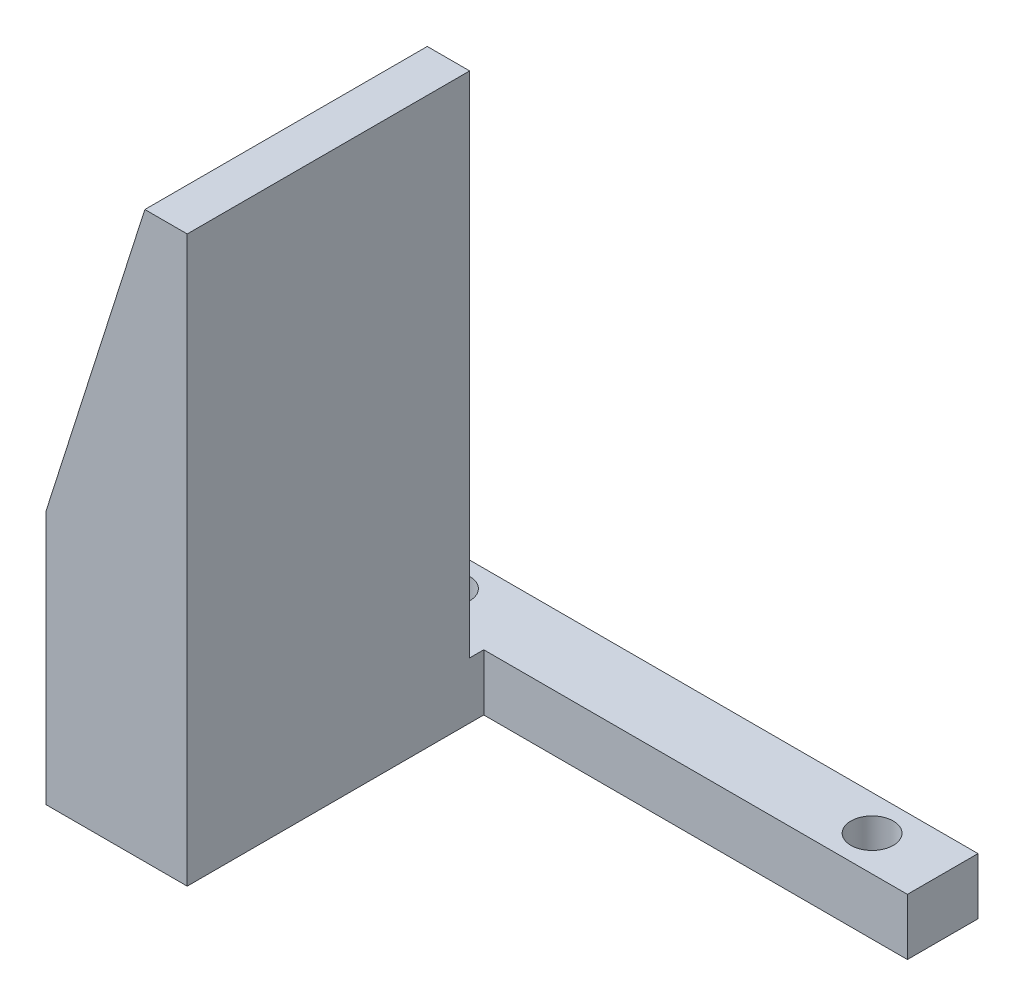
ISO-10303-21;
HEADER;
FILE_DESCRIPTION(('STEP AP214'),'2;1');
FILE_NAME('part.step','',(''),(''),'','','');
FILE_SCHEMA(('AUTOMOTIVE_DESIGN { 1 0 10303 214 1 1 1 1 }'));
ENDSEC;
DATA;
#1=APPLICATION_CONTEXT('core data for automotive mechanical design processes');
#2=APPLICATION_PROTOCOL_DEFINITION('international standard','automotive_design',2000,#1);
#3=PRODUCT_CONTEXT('',#1,'mechanical');
#4=PRODUCT('Part','Part','',(#3));
#5=PRODUCT_RELATED_PRODUCT_CATEGORY('part','',(#4));
#6=PRODUCT_DEFINITION_FORMATION('','',#4);
#7=PRODUCT_DEFINITION_CONTEXT('part definition',#1,'design');
#8=PRODUCT_DEFINITION('design','',#6,#7);
#9=PRODUCT_DEFINITION_SHAPE('','',#8);
#10=(LENGTH_UNIT() NAMED_UNIT(*) SI_UNIT(.MILLI.,.METRE.));
#11=(NAMED_UNIT(*) PLANE_ANGLE_UNIT() SI_UNIT($,.RADIAN.));
#12=(NAMED_UNIT(*) SI_UNIT($,.STERADIAN.) SOLID_ANGLE_UNIT());
#13=UNCERTAINTY_MEASURE_WITH_UNIT(LENGTH_MEASURE(1.E-05),#10,'distance_accuracy_value','');
#14=(GEOMETRIC_REPRESENTATION_CONTEXT(3) GLOBAL_UNCERTAINTY_ASSIGNED_CONTEXT((#13)) GLOBAL_UNIT_ASSIGNED_CONTEXT((#10,
#11,#12)) REPRESENTATION_CONTEXT('',''));
#15=CARTESIAN_POINT('',(0.,0.,0.));
#16=DIRECTION('',(0.,0.,1.));
#17=DIRECTION('',(1.,0.,0.));
#18=AXIS2_PLACEMENT_3D('',#15,#16,#17);
#19=CARTESIAN_POINT('',(-10.,0.,20.));
#20=DIRECTION('',(0.,1.,0.));
#21=DIRECTION('',(0.,0.,1.));
#22=AXIS2_PLACEMENT_3D('',#19,#20,#21);
#23=PLANE('',#22);
#24=DIRECTION('',(0.,0.,-1.));
#25=VECTOR('',#24,1.);
#26=CARTESIAN_POINT('',(-10.,0.,20.));
#27=LINE('',#26,#25);
#28=CARTESIAN_POINT('',(-10.,0.,20.));
#29=VERTEX_POINT('',#28);
#30=CARTESIAN_POINT('',(-10.,0.,-6.));
#31=VERTEX_POINT('',#30);
#32=EDGE_CURVE('E117',#29,#31,#27,.T.);
#33=ORIENTED_EDGE('',*,*,#32,.T.);
#34=DIRECTION('',(1.,0.,0.));
#35=VECTOR('',#34,1.);
#36=CARTESIAN_POINT('',(-10.,0.,-6.));
#37=LINE('',#36,#35);
#38=CARTESIAN_POINT('',(30.,0.,-6.));
#39=VERTEX_POINT('',#38);
#40=EDGE_CURVE('E183',#31,#39,#37,.T.);
#41=ORIENTED_EDGE('',*,*,#40,.T.);
#42=DIRECTION('',(0.,0.,1.));
#43=VECTOR('',#42,1.);
#44=CARTESIAN_POINT('',(30.,0.,-6.));
#45=LINE('',#44,#43);
#46=CARTESIAN_POINT('',(30.,0.,-1.));
#47=VERTEX_POINT('',#46);
#48=EDGE_CURVE('E179',#39,#47,#45,.T.);
#49=ORIENTED_EDGE('',*,*,#48,.T.);
#50=DIRECTION('',(-1.,0.,0.));
#51=VECTOR('',#50,1.);
#52=CARTESIAN_POINT('',(30.,0.,-1.));
#53=LINE('',#52,#51);
#54=CARTESIAN_POINT('',(0.,0.,-1.));
#55=VERTEX_POINT('',#54);
#56=EDGE_CURVE('E176',#47,#55,#53,.T.);
#57=ORIENTED_EDGE('',*,*,#56,.T.);
#58=DIRECTION('',(0.,0.,-1.));
#59=VECTOR('',#58,1.);
#60=CARTESIAN_POINT('',(0.,0.,20.));
#61=LINE('',#60,#59);
#62=CARTESIAN_POINT('',(0.,0.,20.));
#63=VERTEX_POINT('',#62);
#64=EDGE_CURVE('E11',#63,#55,#61,.T.);
#65=ORIENTED_EDGE('',*,*,#64,.F.);
#66=DIRECTION('',(1.,0.,0.));
#67=VECTOR('',#66,1.);
#68=CARTESIAN_POINT('',(-10.,0.,20.));
#69=LINE('',#68,#67);
#70=EDGE_CURVE('E133',#29,#63,#69,.T.);
#71=ORIENTED_EDGE('',*,*,#70,.F.);
#72=EDGE_LOOP('',(#33,#41,#49,#57,#65,#71));
#73=FACE_BOUND('',#72,.T.);
#74=CARTESIAN_POINT('',(-5.,0.,-3.5));
#75=DIRECTION('',(0.,-1.,0.));
#76=DIRECTION('',(0.,0.,-1.));
#77=AXIS2_PLACEMENT_3D('',#74,#75,#76);
#78=CIRCLE('',#77,1.5);
#79=CARTESIAN_POINT('',(-5.,0.,-5.));
#80=VERTEX_POINT('',#79);
#81=EDGE_CURVE('E214',#80,#80,#78,.T.);
#82=ORIENTED_EDGE('',*,*,#81,.F.);
#83=EDGE_LOOP('',(#82));
#84=FACE_BOUND('',#83,.T.);
#85=CARTESIAN_POINT('',(25.,0.,-3.5));
#86=DIRECTION('',(0.,-1.,0.));
#87=DIRECTION('',(0.,0.,-1.));
#88=AXIS2_PLACEMENT_3D('',#85,#86,#87);
#89=CIRCLE('',#88,1.5);
#90=CARTESIAN_POINT('',(25.,0.,-5.));
#91=VERTEX_POINT('',#90);
#92=EDGE_CURVE('E206',#91,#91,#89,.T.);
#93=ORIENTED_EDGE('',*,*,#92,.F.);
#94=EDGE_LOOP('',(#93));
#95=FACE_BOUND('',#94,.T.);
#96=ADVANCED_FACE('F39',(#73,#84,#95),#23,.F.);
#97=CARTESIAN_POINT('',(0.,0.,20.));
#98=DIRECTION('',(-1.,0.,0.));
#99=DIRECTION('',(0.,0.,1.));
#100=AXIS2_PLACEMENT_3D('',#97,#98,#99);
#101=PLANE('',#100);
#102=ORIENTED_EDGE('',*,*,#64,.T.);
#103=DIRECTION('',(0.,-1.,0.));
#104=VECTOR('',#103,1.);
#105=CARTESIAN_POINT('',(0.,4.,-1.));
#106=LINE('',#105,#104);
#107=CARTESIAN_POINT('',(0.,4.,-1.));
#108=VERTEX_POINT('',#107);
#109=EDGE_CURVE('E124',#108,#55,#106,.T.);
#110=ORIENTED_EDGE('',*,*,#109,.F.);
#111=DIRECTION('',(0.,0.,1.));
#112=VECTOR('',#111,1.);
#113=CARTESIAN_POINT('',(0.,4.,-1.));
#114=LINE('',#113,#112);
#115=CARTESIAN_POINT('',(0.,4.,0.));
#116=VERTEX_POINT('',#115);
#117=EDGE_CURVE('E165',#108,#116,#114,.T.);
#118=ORIENTED_EDGE('',*,*,#117,.T.);
#119=DIRECTION('',(0.,1.,0.));
#120=VECTOR('',#119,1.);
#121=CARTESIAN_POINT('',(0.,0.,0.));
#122=LINE('',#121,#120);
#123=CARTESIAN_POINT('',(0.,40.,0.));
#124=VERTEX_POINT('',#123);
#125=EDGE_CURVE('E121',#116,#124,#122,.T.);
#126=ORIENTED_EDGE('',*,*,#125,.T.);
#127=DIRECTION('',(0.,0.,-1.));
#128=VECTOR('',#127,1.);
#129=CARTESIAN_POINT('',(0.,40.,20.));
#130=LINE('',#129,#128);
#131=CARTESIAN_POINT('',(0.,40.,20.));
#132=VERTEX_POINT('',#131);
#133=EDGE_CURVE('E47',#132,#124,#130,.T.);
#134=ORIENTED_EDGE('',*,*,#133,.F.);
#135=DIRECTION('',(0.,1.,0.));
#136=VECTOR('',#135,1.);
#137=CARTESIAN_POINT('',(0.,0.,20.));
#138=LINE('',#137,#136);
#139=EDGE_CURVE('E90',#63,#132,#138,.T.);
#140=ORIENTED_EDGE('',*,*,#139,.F.);
#141=EDGE_LOOP('',(#102,#110,#118,#126,#134,#140));
#142=FACE_BOUND('',#141,.T.);
#143=ADVANCED_FACE('F233',(#142),#101,.F.);
#144=CARTESIAN_POINT('',(0.,40.,20.));
#145=DIRECTION('',(0.,-1.,0.));
#146=DIRECTION('',(0.,0.,-1.));
#147=AXIS2_PLACEMENT_3D('',#144,#145,#146);
#148=PLANE('',#147);
#149=DIRECTION('',(-1.,0.,0.));
#150=VECTOR('',#149,1.);
#151=CARTESIAN_POINT('',(0.,40.,0.));
#152=LINE('',#151,#150);
#153=CARTESIAN_POINT('',(-3.,40.,0.));
#154=VERTEX_POINT('',#153);
#155=EDGE_CURVE('E109',#124,#154,#152,.T.);
#156=ORIENTED_EDGE('',*,*,#155,.T.);
#157=DIRECTION('',(0.,0.,-1.));
#158=VECTOR('',#157,1.);
#159=CARTESIAN_POINT('',(-3.,40.,20.));
#160=LINE('',#159,#158);
#161=CARTESIAN_POINT('',(-3.,40.,20.));
#162=VERTEX_POINT('',#161);
#163=EDGE_CURVE('E106',#162,#154,#160,.T.);
#164=ORIENTED_EDGE('',*,*,#163,.F.);
#165=DIRECTION('',(-1.,0.,0.));
#166=VECTOR('',#165,1.);
#167=CARTESIAN_POINT('',(0.,40.,20.));
#168=LINE('',#167,#166);
#169=EDGE_CURVE('E97',#132,#162,#168,.T.);
#170=ORIENTED_EDGE('',*,*,#169,.F.);
#171=ORIENTED_EDGE('',*,*,#133,.T.);
#172=EDGE_LOOP('',(#156,#164,#170,#171));
#173=FACE_BOUND('',#172,.T.);
#174=ADVANCED_FACE('F107',(#173),#148,.F.);
#175=CARTESIAN_POINT('',(-3.,40.,20.));
#176=DIRECTION('',(0.952925780013262,-0.303203657276947,0.));
#177=DIRECTION('',(0.303203657276947,0.952925780013262,0.));
#178=AXIS2_PLACEMENT_3D('',#175,#176,#177);
#179=PLANE('',#178);
#180=DIRECTION('',(-0.303203657276947,-0.952925780013262,0.));
#181=VECTOR('',#180,1.);
#182=CARTESIAN_POINT('',(-3.,40.,0.));
#183=LINE('',#182,#181);
#184=CARTESIAN_POINT('',(-10.,18.,0.));
#185=VERTEX_POINT('',#184);
#186=EDGE_CURVE('E82',#154,#185,#183,.T.);
#187=ORIENTED_EDGE('',*,*,#186,.T.);
#188=DIRECTION('',(0.,0.,-1.));
#189=VECTOR('',#188,1.);
#190=CARTESIAN_POINT('',(-10.,18.,20.));
#191=LINE('',#190,#189);
#192=CARTESIAN_POINT('',(-10.,18.,20.));
#193=VERTEX_POINT('',#192);
#194=EDGE_CURVE('E111',#193,#185,#191,.T.);
#195=ORIENTED_EDGE('',*,*,#194,.F.);
#196=DIRECTION('',(-0.303203657276947,-0.952925780013262,0.));
#197=VECTOR('',#196,1.);
#198=CARTESIAN_POINT('',(-3.,40.,20.));
#199=LINE('',#198,#197);
#200=EDGE_CURVE('E101',#162,#193,#199,.T.);
#201=ORIENTED_EDGE('',*,*,#200,.F.);
#202=ORIENTED_EDGE('',*,*,#163,.T.);
#203=EDGE_LOOP('',(#187,#195,#201,#202));
#204=FACE_BOUND('',#203,.T.);
#205=ADVANCED_FACE('F113',(#204),#179,.F.);
#206=CARTESIAN_POINT('',(-10.,18.,20.));
#207=DIRECTION('',(1.,0.,0.));
#208=DIRECTION('',(0.,1.,0.));
#209=AXIS2_PLACEMENT_3D('',#206,#207,#208);
#210=PLANE('',#209);
#211=DIRECTION('',(0.,-1.,0.));
#212=VECTOR('',#211,1.);
#213=CARTESIAN_POINT('',(-10.,18.,0.));
#214=LINE('',#213,#212);
#215=CARTESIAN_POINT('',(-10.,4.,0.));
#216=VERTEX_POINT('',#215);
#217=EDGE_CURVE('E129',#185,#216,#214,.T.);
#218=ORIENTED_EDGE('',*,*,#217,.T.);
#219=DIRECTION('',(0.,0.,-1.));
#220=VECTOR('',#219,1.);
#221=CARTESIAN_POINT('',(-10.,4.,0.));
#222=LINE('',#221,#220);
#223=CARTESIAN_POINT('',(-10.,4.,-6.));
#224=VERTEX_POINT('',#223);
#225=EDGE_CURVE('E54',#216,#224,#222,.T.);
#226=ORIENTED_EDGE('',*,*,#225,.T.);
#227=DIRECTION('',(0.,-1.,0.));
#228=VECTOR('',#227,1.);
#229=CARTESIAN_POINT('',(-10.,4.,-6.));
#230=LINE('',#229,#228);
#231=EDGE_CURVE('E151',#224,#31,#230,.T.);
#232=ORIENTED_EDGE('',*,*,#231,.T.);
#233=ORIENTED_EDGE('',*,*,#32,.F.);
#234=DIRECTION('',(0.,-1.,0.));
#235=VECTOR('',#234,1.);
#236=CARTESIAN_POINT('',(-10.,18.,20.));
#237=LINE('',#236,#235);
#238=EDGE_CURVE('E63',#193,#29,#237,.T.);
#239=ORIENTED_EDGE('',*,*,#238,.F.);
#240=ORIENTED_EDGE('',*,*,#194,.T.);
#241=EDGE_LOOP('',(#218,#226,#232,#233,#239,#240));
#242=FACE_BOUND('',#241,.T.);
#243=ADVANCED_FACE('F145',(#242),#210,.F.);
#244=CARTESIAN_POINT('',(0.,0.,20.));
#245=DIRECTION('',(0.,0.,1.));
#246=DIRECTION('',(1.,0.,0.));
#247=AXIS2_PLACEMENT_3D('',#244,#245,#246);
#248=PLANE('',#247);
#249=ORIENTED_EDGE('',*,*,#70,.T.);
#250=ORIENTED_EDGE('',*,*,#139,.T.);
#251=ORIENTED_EDGE('',*,*,#169,.T.);
#252=ORIENTED_EDGE('',*,*,#200,.T.);
#253=ORIENTED_EDGE('',*,*,#238,.T.);
#254=EDGE_LOOP('',(#249,#250,#251,#252,#253));
#255=FACE_BOUND('',#254,.T.);
#256=ADVANCED_FACE('F99',(#255),#248,.T.);
#257=CARTESIAN_POINT('',(0.,0.,0.));
#258=DIRECTION('',(0.,0.,1.));
#259=DIRECTION('',(1.,0.,0.));
#260=AXIS2_PLACEMENT_3D('',#257,#258,#259);
#261=PLANE('',#260);
#262=ORIENTED_EDGE('',*,*,#125,.F.);
#263=DIRECTION('',(-1.,0.,0.));
#264=VECTOR('',#263,1.);
#265=CARTESIAN_POINT('',(0.,4.,0.));
#266=LINE('',#265,#264);
#267=EDGE_CURVE('E143',#116,#216,#266,.T.);
#268=ORIENTED_EDGE('',*,*,#267,.T.);
#269=ORIENTED_EDGE('',*,*,#217,.F.);
#270=ORIENTED_EDGE('',*,*,#186,.F.);
#271=ORIENTED_EDGE('',*,*,#155,.F.);
#272=EDGE_LOOP('',(#262,#268,#269,#270,#271));
#273=FACE_BOUND('',#272,.T.);
#274=ADVANCED_FACE('F141',(#273),#261,.F.);
#275=CARTESIAN_POINT('',(30.,4.,-1.));
#276=DIRECTION('',(0.,0.,1.));
#277=DIRECTION('',(1.,0.,0.));
#278=AXIS2_PLACEMENT_3D('',#275,#276,#277);
#279=PLANE('',#278);
#280=ORIENTED_EDGE('',*,*,#56,.F.);
#281=DIRECTION('',(0.,-1.,0.));
#282=VECTOR('',#281,1.);
#283=CARTESIAN_POINT('',(30.,4.,-1.));
#284=LINE('',#283,#282);
#285=CARTESIAN_POINT('',(30.,4.,-1.));
#286=VERTEX_POINT('',#285);
#287=EDGE_CURVE('E169',#286,#47,#284,.T.);
#288=ORIENTED_EDGE('',*,*,#287,.F.);
#289=DIRECTION('',(-1.,0.,0.));
#290=VECTOR('',#289,1.);
#291=CARTESIAN_POINT('',(30.,4.,-1.));
#292=LINE('',#291,#290);
#293=EDGE_CURVE('E190',#286,#108,#292,.T.);
#294=ORIENTED_EDGE('',*,*,#293,.T.);
#295=ORIENTED_EDGE('',*,*,#109,.T.);
#296=EDGE_LOOP('',(#280,#288,#294,#295));
#297=FACE_BOUND('',#296,.T.);
#298=ADVANCED_FACE('F246',(#297),#279,.T.);
#299=CARTESIAN_POINT('',(30.,4.,-6.));
#300=DIRECTION('',(1.,0.,0.));
#301=DIRECTION('',(0.,0.,-1.));
#302=AXIS2_PLACEMENT_3D('',#299,#300,#301);
#303=PLANE('',#302);
#304=ORIENTED_EDGE('',*,*,#48,.F.);
#305=DIRECTION('',(0.,-1.,0.));
#306=VECTOR('',#305,1.);
#307=CARTESIAN_POINT('',(30.,4.,-6.));
#308=LINE('',#307,#306);
#309=CARTESIAN_POINT('',(30.,4.,-6.));
#310=VERTEX_POINT('',#309);
#311=EDGE_CURVE('E164',#310,#39,#308,.T.);
#312=ORIENTED_EDGE('',*,*,#311,.F.);
#313=DIRECTION('',(0.,0.,1.));
#314=VECTOR('',#313,1.);
#315=CARTESIAN_POINT('',(30.,4.,-6.));
#316=LINE('',#315,#314);
#317=EDGE_CURVE('E194',#310,#286,#316,.T.);
#318=ORIENTED_EDGE('',*,*,#317,.T.);
#319=ORIENTED_EDGE('',*,*,#287,.T.);
#320=EDGE_LOOP('',(#304,#312,#318,#319));
#321=FACE_BOUND('',#320,.T.);
#322=ADVANCED_FACE('F249',(#321),#303,.T.);
#323=CARTESIAN_POINT('',(-10.,4.,-6.));
#324=DIRECTION('',(0.,0.,-1.));
#325=DIRECTION('',(-1.,0.,0.));
#326=AXIS2_PLACEMENT_3D('',#323,#324,#325);
#327=PLANE('',#326);
#328=ORIENTED_EDGE('',*,*,#40,.F.);
#329=ORIENTED_EDGE('',*,*,#231,.F.);
#330=DIRECTION('',(1.,0.,0.));
#331=VECTOR('',#330,1.);
#332=CARTESIAN_POINT('',(-10.,4.,-6.));
#333=LINE('',#332,#331);
#334=EDGE_CURVE('E198',#224,#310,#333,.T.);
#335=ORIENTED_EDGE('',*,*,#334,.T.);
#336=ORIENTED_EDGE('',*,*,#311,.T.);
#337=EDGE_LOOP('',(#328,#329,#335,#336));
#338=FACE_BOUND('',#337,.T.);
#339=ADVANCED_FACE('F242',(#338),#327,.T.);
#340=CARTESIAN_POINT('',(0.,4.,0.));
#341=DIRECTION('',(0.,-1.,0.));
#342=DIRECTION('',(0.,0.,-1.));
#343=AXIS2_PLACEMENT_3D('',#340,#341,#342);
#344=PLANE('',#343);
#345=CARTESIAN_POINT('',(-5.,4.,-3.5));
#346=DIRECTION('',(0.,-1.,0.));
#347=DIRECTION('',(0.,0.,-1.));
#348=AXIS2_PLACEMENT_3D('',#345,#346,#347);
#349=CIRCLE('',#348,1.5);
#350=CARTESIAN_POINT('',(-5.,4.,-5.));
#351=VERTEX_POINT('',#350);
#352=EDGE_CURVE('E210',#351,#351,#349,.T.);
#353=ORIENTED_EDGE('',*,*,#352,.T.);
#354=EDGE_LOOP('',(#353));
#355=FACE_BOUND('',#354,.T.);
#356=CARTESIAN_POINT('',(25.,4.,-3.5));
#357=DIRECTION('',(0.,-1.,0.));
#358=DIRECTION('',(0.,0.,-1.));
#359=AXIS2_PLACEMENT_3D('',#356,#357,#358);
#360=CIRCLE('',#359,1.5);
#361=CARTESIAN_POINT('',(25.,4.,-5.));
#362=VERTEX_POINT('',#361);
#363=EDGE_CURVE('E186',#362,#362,#360,.T.);
#364=ORIENTED_EDGE('',*,*,#363,.T.);
#365=EDGE_LOOP('',(#364));
#366=FACE_BOUND('',#365,.T.);
#367=ORIENTED_EDGE('',*,*,#267,.F.);
#368=ORIENTED_EDGE('',*,*,#117,.F.);
#369=ORIENTED_EDGE('',*,*,#293,.F.);
#370=ORIENTED_EDGE('',*,*,#317,.F.);
#371=ORIENTED_EDGE('',*,*,#334,.F.);
#372=ORIENTED_EDGE('',*,*,#225,.F.);
#373=EDGE_LOOP('',(#367,#368,#369,#370,#371,#372));
#374=FACE_BOUND('',#373,.T.);
#375=ADVANCED_FACE('F222',(#355,#366,#374),#344,.F.);
#376=CARTESIAN_POINT('',(25.,4.,-3.5));
#377=DIRECTION('',(0.,-1.,0.));
#378=DIRECTION('',(0.,0.,-1.));
#379=AXIS2_PLACEMENT_3D('',#376,#377,#378);
#380=CYLINDRICAL_SURFACE('',#379,1.5);
#381=ORIENTED_EDGE('',*,*,#363,.F.);
#382=EDGE_LOOP('',(#381));
#383=FACE_BOUND('',#382,.T.);
#384=ORIENTED_EDGE('',*,*,#92,.T.);
#385=EDGE_LOOP('',(#384));
#386=FACE_BOUND('',#385,.T.);
#387=ADVANCED_FACE('F228',(#383,#386),#380,.F.);
#388=CARTESIAN_POINT('',(-5.,4.,-3.5));
#389=DIRECTION('',(0.,-1.,0.));
#390=DIRECTION('',(0.,0.,-1.));
#391=AXIS2_PLACEMENT_3D('',#388,#389,#390);
#392=CYLINDRICAL_SURFACE('',#391,1.5);
#393=ORIENTED_EDGE('',*,*,#352,.F.);
#394=EDGE_LOOP('',(#393));
#395=FACE_BOUND('',#394,.T.);
#396=ORIENTED_EDGE('',*,*,#81,.T.);
#397=EDGE_LOOP('',(#396));
#398=FACE_BOUND('',#397,.T.);
#399=ADVANCED_FACE('F225',(#395,#398),#392,.F.);
#400=CLOSED_SHELL('',(#96,#143,#174,#205,#243,#256,#274,#298,#322,#339,#375,#387,#399));
#401=MANIFOLD_SOLID_BREP('B2',#400);
#402=ADVANCED_BREP_SHAPE_REPRESENTATION('',(#18,#401),#14);
#403=SHAPE_DEFINITION_REPRESENTATION(#9,#402);
ENDSEC;
END-ISO-10303-21;
